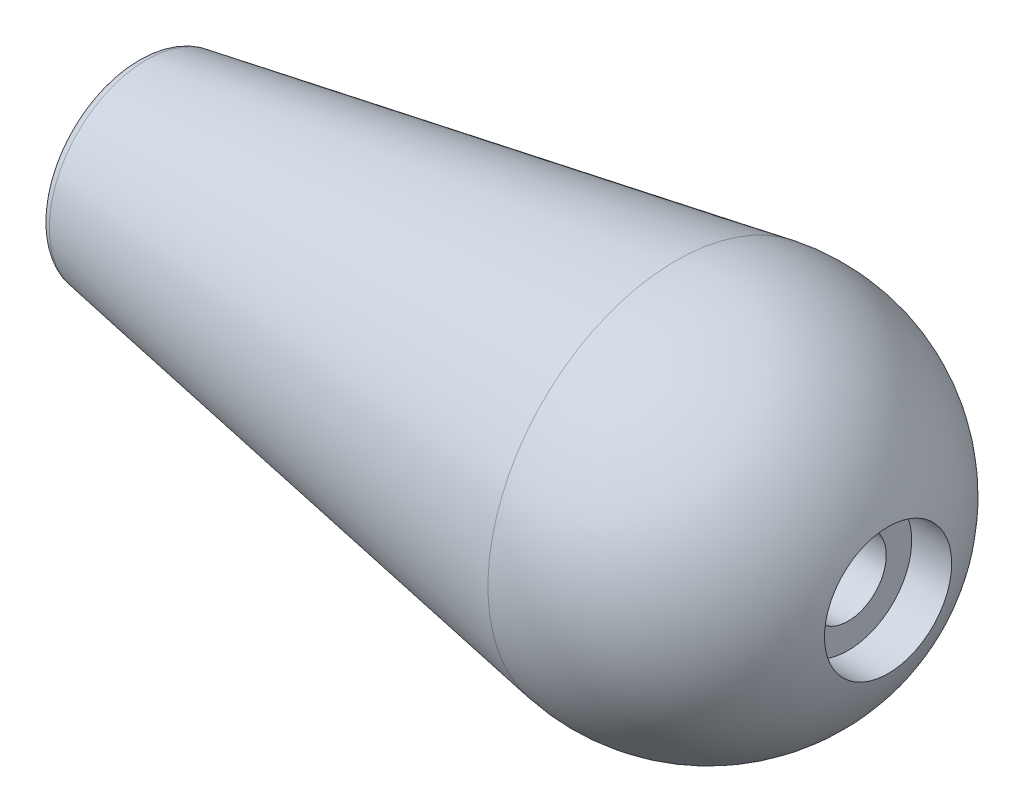
ISO-10303-21;
HEADER;
FILE_DESCRIPTION(('STEP AP214'),'2;1');
FILE_NAME('part.step','',(''),(''),'','','');
FILE_SCHEMA(('AUTOMOTIVE_DESIGN { 1 0 10303 214 1 1 1 1 }'));
ENDSEC;
DATA;
#1=APPLICATION_CONTEXT('core data for automotive mechanical design processes');
#2=APPLICATION_PROTOCOL_DEFINITION('international standard','automotive_design',2000,#1);
#3=PRODUCT_CONTEXT('',#1,'mechanical');
#4=PRODUCT('Part','Part','',(#3));
#5=PRODUCT_RELATED_PRODUCT_CATEGORY('part','',(#4));
#6=PRODUCT_DEFINITION_FORMATION('','',#4);
#7=PRODUCT_DEFINITION_CONTEXT('part definition',#1,'design');
#8=PRODUCT_DEFINITION('design','',#6,#7);
#9=PRODUCT_DEFINITION_SHAPE('','',#8);
#10=(LENGTH_UNIT() NAMED_UNIT(*) SI_UNIT(.MILLI.,.METRE.));
#11=(NAMED_UNIT(*) PLANE_ANGLE_UNIT() SI_UNIT($,.RADIAN.));
#12=(NAMED_UNIT(*) SI_UNIT($,.STERADIAN.) SOLID_ANGLE_UNIT());
#13=UNCERTAINTY_MEASURE_WITH_UNIT(LENGTH_MEASURE(1.E-05),#10,'distance_accuracy_value','');
#14=(GEOMETRIC_REPRESENTATION_CONTEXT(3) GLOBAL_UNCERTAINTY_ASSIGNED_CONTEXT((#13)) GLOBAL_UNIT_ASSIGNED_CONTEXT((#10,
#11,#12)) REPRESENTATION_CONTEXT('',''));
#15=CARTESIAN_POINT('',(0.,0.,0.));
#16=DIRECTION('',(0.,0.,1.));
#17=DIRECTION('',(1.,0.,0.));
#18=AXIS2_PLACEMENT_3D('',#15,#16,#17);
#19=CARTESIAN_POINT('',(0.,0.,0.));
#20=DIRECTION('',(1.,0.,0.));
#21=DIRECTION('',(0.,0.,-1.));
#22=AXIS2_PLACEMENT_3D('',#19,#20,#21);
#23=PLANE('',#22);
#24=CARTESIAN_POINT('',(0.,0.,0.));
#25=DIRECTION('',(1.,0.,0.));
#26=DIRECTION('',(0.,0.,-1.));
#27=AXIS2_PLACEMENT_3D('',#24,#25,#26);
#28=CIRCLE('',#27,13.3138593383655);
#29=CARTESIAN_POINT('',(0.,0.,-13.3138593383655));
#30=VERTEX_POINT('',#29);
#31=EDGE_CURVE('E44',#30,#30,#28,.F.);
#32=ORIENTED_EDGE('',*,*,#31,.T.);
#33=EDGE_LOOP('',(#32));
#34=FACE_BOUND('',#33,.T.);
#35=CARTESIAN_POINT('',(0.,0.,0.));
#36=DIRECTION('',(1.,0.,0.));
#37=DIRECTION('',(0.,1.,0.));
#38=AXIS2_PLACEMENT_3D('',#35,#36,#37);
#39=CIRCLE('',#38,10.);
#40=CARTESIAN_POINT('',(0.,10.,0.));
#41=VERTEX_POINT('',#40);
#42=EDGE_CURVE('E56',#41,#41,#39,.T.);
#43=ORIENTED_EDGE('',*,*,#42,.T.);
#44=EDGE_LOOP('',(#43));
#45=FACE_BOUND('',#44,.T.);
#46=ADVANCED_FACE('F37',(#34,#45),#23,.F.);
#47=CARTESIAN_POINT('',(90.,0.,0.));
#48=DIRECTION('',(-1.,0.,0.));
#49=DIRECTION('',(0.,0.,-1.));
#50=AXIS2_PLACEMENT_3D('',#47,#48,#49);
#51=SPHERICAL_SURFACE('',#50,30.);
#52=CARTESIAN_POINT('',(118.284271247462,0.,0.));
#53=DIRECTION('',(-1.,0.,0.));
#54=DIRECTION('',(0.,-1.,0.));
#55=AXIS2_PLACEMENT_3D('',#52,#53,#54);
#56=CIRCLE('',#55,10.);
#57=CARTESIAN_POINT('',(118.284271247462,0.,-9.99999999999999));
#58=VERTEX_POINT('',#57);
#59=EDGE_CURVE('E52',#58,#58,#56,.T.);
#60=CARTESIAN_POINT('',(84.9280237674633,0.,0.));
#61=DIRECTION('',(-1.,0.,0.));
#62=DIRECTION('',(0.,0.,1.));
#63=AXIS2_PLACEMENT_3D('',#60,#61,#62);
#64=CIRCLE('',#63,29.5681426047796);
#65=CARTESIAN_POINT('',(84.9280237674633,0.,-29.5681426047796));
#66=VERTEX_POINT('',#65);
#67=EDGE_CURVE('E48',#66,#66,#64,.T.);
#68=CARTESIAN_POINT('',(118.284271247462,0.,-9.99999999999999));
#69=CARTESIAN_POINT('',(118.138356402819,0.,-10.4127292681072));
#70=CARTESIAN_POINT('',(117.983395700096,0.,-10.8222598122694));
#71=CARTESIAN_POINT('',(117.655706342081,0.,-11.6341496055381));
#72=CARTESIAN_POINT('',(117.48297768679,0.,-12.0365088546445));
#73=CARTESIAN_POINT('',(117.120076187232,0.,-12.8332822106355));
#74=CARTESIAN_POINT('',(116.929903342965,0.,-13.2276963175202));
#75=CARTESIAN_POINT('',(116.532479775293,0.,-14.0078244470368));
#76=CARTESIAN_POINT('',(116.325229051886,0.,-14.3935384696687));
#77=CARTESIAN_POINT('',(115.894046313687,0.,-15.1555271719787));
#78=CARTESIAN_POINT('',(115.670114298895,0.,-15.5318018516567));
#79=CARTESIAN_POINT('',(115.205998182932,0.,-16.274190960021));
#80=CARTESIAN_POINT('',(114.965814081762,0.,-16.6403053887073));
#81=CARTESIAN_POINT('',(114.469653962492,0.,-17.3616724838452));
#82=CARTESIAN_POINT('',(114.213677944392,0.,-17.7169251502968));
#83=CARTESIAN_POINT('',(113.686424465955,0.,-18.4158880404616));
#84=CARTESIAN_POINT('',(113.415147005617,0.,-18.7595982641747));
#85=CARTESIAN_POINT('',(112.857810423236,0.,-19.4348176992564));
#86=CARTESIAN_POINT('',(112.571751301193,0.,-19.7663269106251));
#87=CARTESIAN_POINT('',(111.985399501824,0.,-20.4165091306151));
#88=CARTESIAN_POINT('',(111.685106824499,0.,-20.7351821392365));
#89=CARTESIAN_POINT('',(111.070863292393,0.,-21.3590813578658));
#90=CARTESIAN_POINT('',(110.756912437612,0.,-21.6643075678738));
#91=CARTESIAN_POINT('',(110.115954098518,0.,-22.2607283583463));
#92=CARTESIAN_POINT('',(109.788946614204,0.,-22.551922938811));
#93=CARTESIAN_POINT('',(109.122501581153,0.,-23.1197225246492));
#94=CARTESIAN_POINT('',(108.783064032416,0.,-23.3963275300227));
#95=CARTESIAN_POINT('',(108.092409252363,0.,-23.9344179746017));
#96=CARTESIAN_POINT('',(107.741192021047,0.,-24.1959034138072));
#97=CARTESIAN_POINT('',(107.027650828223,0.,-24.7032537049285));
#98=CARTESIAN_POINT('',(106.665326866715,0.,-24.9491185568444));
#99=CARTESIAN_POINT('',(105.930266447031,0.,-25.4247565822078));
#100=CARTESIAN_POINT('',(105.557529988855,0.,-25.6545297556555));
#101=CARTESIAN_POINT('',(104.802358760297,0.,-26.097544165484));
#102=CARTESIAN_POINT('',(104.419923989916,0.,-26.310785401865));
#103=CARTESIAN_POINT('',(103.646088903934,0.,-26.7203273551028));
#104=CARTESIAN_POINT('',(103.254688588335,0.,-26.9166280719597));
#105=CARTESIAN_POINT('',(102.463672357404,0.,-27.2919128627002));
#106=CARTESIAN_POINT('',(102.064056442073,0.,-27.4708969365838));
#107=CARTESIAN_POINT('',(101.257374698726,0.,-27.8112054976125));
#108=CARTESIAN_POINT('',(100.850308870711,0.,-27.9725299847575));
#109=CARTESIAN_POINT('',(100.029507263505,0.,-28.2772102653212));
#110=CARTESIAN_POINT('',(99.6157714843147,0.,-28.4205660587399));
#111=CARTESIAN_POINT('',(98.7824227162743,0.,-28.6890342739311));
#112=CARTESIAN_POINT('',(98.3628097274244,0.,-28.8141466957036));
#113=CARTESIAN_POINT('',(97.5185105426613,0.,-29.0458884449612));
#114=CARTESIAN_POINT('',(97.0938243467481,0.,-29.1525177724462));
#115=CARTESIAN_POINT('',(96.2401924709778,0.,-29.347089025417));
#116=CARTESIAN_POINT('',(95.8112467911206,0.,-29.4350309509028));
#117=CARTESIAN_POINT('',(94.9499178321202,0.,-29.5920588973314));
#118=CARTESIAN_POINT('',(94.517534552977,0.,-29.6611449182741));
#119=CARTESIAN_POINT('',(93.6501588662421,0.,-29.7803286856806));
#120=CARTESIAN_POINT('',(93.2151664586505,0.,-29.8304264321444));
#121=CARTESIAN_POINT('',(92.3434059868053,0.,-29.9115376498024));
#122=CARTESIAN_POINT('',(91.9066379225519,0.,-29.9425511209965));
#123=CARTESIAN_POINT('',(91.0321630050521,0.,-29.9854344041979));
#124=CARTESIAN_POINT('',(90.5944561518059,0.,-29.9973042162051));
#125=CARTESIAN_POINT('',(89.718942346565,0.,-30.0018772897223));
#126=CARTESIAN_POINT('',(89.2811353945705,0.,-29.9945805512324));
#127=CARTESIAN_POINT('',(88.406260185043,0.,-29.9608350573247));
#128=CARTESIAN_POINT('',(87.9691919275101,0.,-29.9343863019068));
#129=CARTESIAN_POINT('',(87.0966318162508,0.,-29.8623853891499));
#130=CARTESIAN_POINT('',(86.6611399625244,0.,-29.8168332318109));
#131=CARTESIAN_POINT('',(85.7925661105086,0.,-29.7067204924739));
#132=CARTESIAN_POINT('',(85.3594841122191,0.,-29.6421599104759));
#133=CARTESIAN_POINT('',(84.9280237674633,0.,-29.5681426047796));
#134=B_SPLINE_CURVE_WITH_KNOTS('',3,(#68,#69,#70,#71,#72,#73,#74,#75,#76,#77,#78,#79,#80,#81,
#82,#83,#84,#85,#86,#87,#88,#89,#90,#91,#92,#93,#94,#95,#96,#97,#98,#99,#100,#101,#102,#103,
#104,#105,#106,#107,#108,#109,#110,#111,#112,#113,#114,#115,#116,#117,#118,#119,#120,#121,#122,
#123,#124,#125,#126,#127,#128,#129,#130,#131,#132,#133),.UNSPECIFIED.,.F.,.F.,(4,2,2,2,2,2,2,2,
2,2,2,2,2,2,2,2,2,2,2,2,2,2,2,2,2,2,2,2,2,2,2,2,4),(0.,1.31318380121515,2.62636760243029,
3.93955140364543,5.25273520486058,6.56591900607572,7.87910280729086,9.19228660850601,
10.5054704097211,11.8186542109363,13.1318380121514,14.4450218133666,15.7582056145817,
17.0713894157969,18.384573217012,19.6977570182272,21.0109408194423,22.3241246206574,
23.6373084218726,24.9504922230877,26.2636760243029,27.576859825518,28.8900436267332,
30.2032274279483,31.5164112291635,32.8295950303786,34.1427788315937,35.4559626328089,
36.769146434024,38.0823302352392,39.3955140364543,40.7086978376695,42.0218816388846),.UNSPECIFIED.);
#135=EDGE_CURVE('BSEAM83',#58,#66,#134,.T.);
#136=ORIENTED_EDGE('',*,*,#59,.T.);
#137=ORIENTED_EDGE('',*,*,#67,.F.);
#138=ORIENTED_EDGE('',*,*,#135,.T.);
#139=ORIENTED_EDGE('',*,*,#135,.F.);
#140=EDGE_LOOP('',(#136,#138,#137,#139));
#141=FACE_BOUND('',#140,.T.);
#142=ADVANCED_FACE('F83',(#141),#51,.T.);
#143=CARTESIAN_POINT('',(84.9280237674633,0.,0.));
#144=DIRECTION('',(1.,0.,0.));
#145=DIRECTION('',(0.,0.,-1.));
#146=AXIS2_PLACEMENT_3D('',#143,#144,#145);
#147=CONICAL_SURFACE('',#146,29.5681426047796,0.169881822982759);
#148=CARTESIAN_POINT('',(1.66186825116424,0.,0.));
#149=DIRECTION('',(-1.,0.,0.));
#150=DIRECTION('',(0.,0.,1.));
#151=AXIS2_PLACEMENT_3D('',#148,#149,#150);
#152=CIRCLE('',#151,15.2850688453508);
#153=CARTESIAN_POINT('',(1.66186825116424,0.,15.2850688453508));
#154=VERTEX_POINT('',#153);
#155=EDGE_CURVE('E10',#154,#154,#152,.F.);
#156=ORIENTED_EDGE('',*,*,#155,.T.);
#157=EDGE_LOOP('',(#156));
#158=FACE_BOUND('',#157,.T.);
#159=ORIENTED_EDGE('',*,*,#67,.T.);
#160=EDGE_LOOP('',(#159));
#161=FACE_BOUND('',#160,.T.);
#162=ADVANCED_FACE('F79',(#158,#161),#147,.T.);
#163=CARTESIAN_POINT('',(120.,0.,0.));
#164=DIRECTION('',(1.,0.,0.));
#165=DIRECTION('',(0.,1.,0.));
#166=AXIS2_PLACEMENT_3D('',#163,#164,#165);
#167=CYLINDRICAL_SURFACE('',#166,10.);
#168=CARTESIAN_POINT('',(112.,0.,0.));
#169=DIRECTION('',(1.,0.,0.));
#170=DIRECTION('',(0.,1.,0.));
#171=AXIS2_PLACEMENT_3D('',#168,#169,#170);
#172=CIRCLE('',#171,10.);
#173=CARTESIAN_POINT('',(112.,10.,0.));
#174=VERTEX_POINT('',#173);
#175=EDGE_CURVE('E69',#174,#174,#172,.T.);
#176=ORIENTED_EDGE('',*,*,#175,.F.);
#177=EDGE_LOOP('',(#176));
#178=FACE_BOUND('',#177,.T.);
#179=ORIENTED_EDGE('',*,*,#59,.F.);
#180=EDGE_LOOP('',(#179));
#181=FACE_BOUND('',#180,.T.);
#182=ADVANCED_FACE('F75',(#178,#181),#167,.F.);
#183=CARTESIAN_POINT('',(120.,0.,0.));
#184=DIRECTION('',(1.,0.,0.));
#185=DIRECTION('',(0.,1.,0.));
#186=AXIS2_PLACEMENT_3D('',#183,#184,#185);
#187=CYLINDRICAL_SURFACE('',#186,10.);
#188=ORIENTED_EDGE('',*,*,#42,.F.);
#189=EDGE_LOOP('',(#188));
#190=FACE_BOUND('',#189,.T.);
#191=CARTESIAN_POINT('',(8.00000000000001,0.,0.));
#192=DIRECTION('',(1.,0.,0.));
#193=DIRECTION('',(0.,1.,0.));
#194=AXIS2_PLACEMENT_3D('',#191,#192,#193);
#195=CIRCLE('',#194,10.);
#196=CARTESIAN_POINT('',(8.00000000000001,10.,0.));
#197=VERTEX_POINT('',#196);
#198=EDGE_CURVE('E60',#197,#197,#195,.T.);
#199=ORIENTED_EDGE('',*,*,#198,.T.);
#200=EDGE_LOOP('',(#199));
#201=FACE_BOUND('',#200,.T.);
#202=ADVANCED_FACE('F78',(#190,#201),#187,.F.);
#203=CARTESIAN_POINT('',(8.,10.,0.));
#204=DIRECTION('',(1.,0.,0.));
#205=DIRECTION('',(0.,1.,0.));
#206=AXIS2_PLACEMENT_3D('',#203,#204,#205);
#207=PLANE('',#206);
#208=ORIENTED_EDGE('',*,*,#198,.F.);
#209=EDGE_LOOP('',(#208));
#210=FACE_BOUND('',#209,.T.);
#211=CARTESIAN_POINT('',(8.00000000000001,0.,0.));
#212=DIRECTION('',(1.,0.,0.));
#213=DIRECTION('',(0.,1.,0.));
#214=AXIS2_PLACEMENT_3D('',#211,#212,#213);
#215=CIRCLE('',#214,5.99999999999999);
#216=CARTESIAN_POINT('',(8.00000000000001,5.99999999999999,0.));
#217=VERTEX_POINT('',#216);
#218=EDGE_CURVE('E63',#217,#217,#215,.T.);
#219=ORIENTED_EDGE('',*,*,#218,.T.);
#220=EDGE_LOOP('',(#219));
#221=FACE_BOUND('',#220,.T.);
#222=ADVANCED_FACE('F104',(#210,#221),#207,.F.);
#223=CARTESIAN_POINT('',(120.,0.,0.));
#224=DIRECTION('',(1.,0.,0.));
#225=DIRECTION('',(0.,1.,0.));
#226=AXIS2_PLACEMENT_3D('',#223,#224,#225);
#227=CYLINDRICAL_SURFACE('',#226,5.99999999999999);
#228=ORIENTED_EDGE('',*,*,#218,.F.);
#229=EDGE_LOOP('',(#228));
#230=FACE_BOUND('',#229,.T.);
#231=CARTESIAN_POINT('',(112.,0.,0.));
#232=DIRECTION('',(1.,0.,0.));
#233=DIRECTION('',(0.,1.,0.));
#234=AXIS2_PLACEMENT_3D('',#231,#232,#233);
#235=CIRCLE('',#234,5.99999999999999);
#236=CARTESIAN_POINT('',(112.,5.99999999999999,0.));
#237=VERTEX_POINT('',#236);
#238=EDGE_CURVE('E66',#237,#237,#235,.T.);
#239=ORIENTED_EDGE('',*,*,#238,.T.);
#240=EDGE_LOOP('',(#239));
#241=FACE_BOUND('',#240,.T.);
#242=ADVANCED_FACE('F109',(#230,#241),#227,.F.);
#243=CARTESIAN_POINT('',(112.,5.99999999999999,0.));
#244=DIRECTION('',(-1.,0.,0.));
#245=DIRECTION('',(0.,-1.,0.));
#246=AXIS2_PLACEMENT_3D('',#243,#244,#245);
#247=PLANE('',#246);
#248=ORIENTED_EDGE('',*,*,#238,.F.);
#249=EDGE_LOOP('',(#248));
#250=FACE_BOUND('',#249,.T.);
#251=ORIENTED_EDGE('',*,*,#175,.T.);
#252=EDGE_LOOP('',(#251));
#253=FACE_BOUND('',#252,.T.);
#254=ADVANCED_FACE('F73',(#250,#253),#247,.F.);
#255=CARTESIAN_POINT('',(2.,0.,0.));
#256=DIRECTION('',(1.,0.,0.));
#257=DIRECTION('',(0.,0.,-1.));
#258=AXIS2_PLACEMENT_3D('',#255,#256,#257);
#259=TOROIDAL_SURFACE('',#258,13.3138593383655,2.);
#260=ORIENTED_EDGE('',*,*,#155,.F.);
#261=EDGE_LOOP('',(#260));
#262=FACE_BOUND('',#261,.T.);
#263=ORIENTED_EDGE('',*,*,#31,.F.);
#264=EDGE_LOOP('',(#263));
#265=FACE_BOUND('',#264,.T.);
#266=ADVANCED_FACE('F39',(#262,#265),#259,.T.);
#267=CLOSED_SHELL('',(#46,#142,#162,#182,#202,#222,#242,#254,#266));
#268=MANIFOLD_SOLID_BREP('B2',#267);
#269=ADVANCED_BREP_SHAPE_REPRESENTATION('',(#18,#268),#14);
#270=SHAPE_DEFINITION_REPRESENTATION(#9,#269);
ENDSEC;
END-ISO-10303-21;
